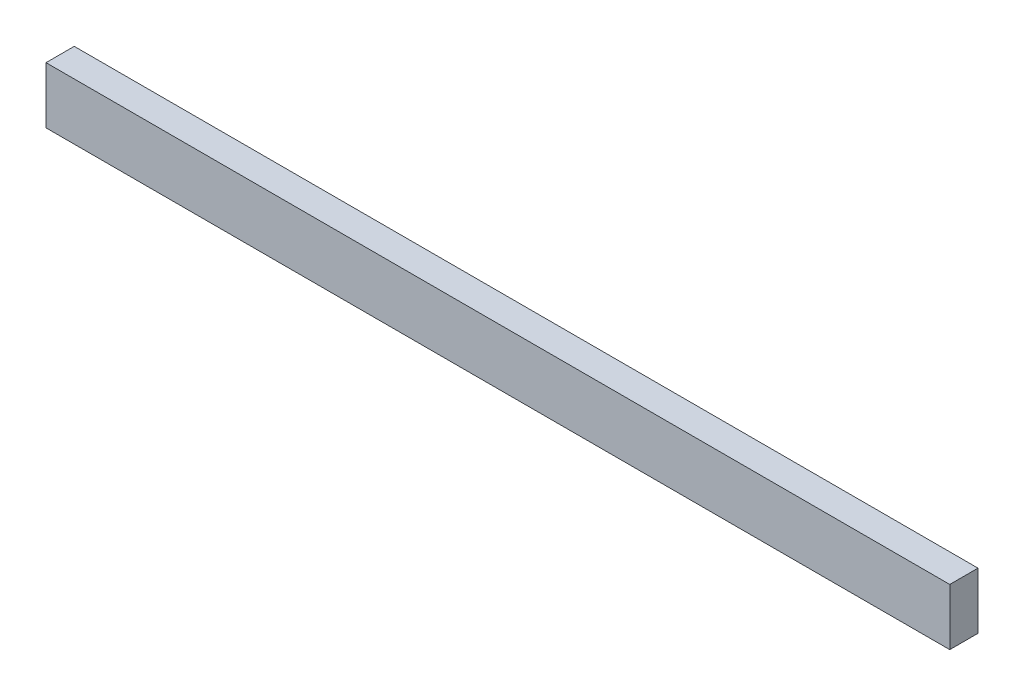
ISO-10303-21;
HEADER;
FILE_DESCRIPTION(('STEP AP214'),'2;1');
FILE_NAME('part.step','',(''),(''),'','','');
FILE_SCHEMA(('AUTOMOTIVE_DESIGN { 1 0 10303 214 1 1 1 1 }'));
ENDSEC;
DATA;
#1=APPLICATION_CONTEXT('core data for automotive mechanical design processes');
#2=APPLICATION_PROTOCOL_DEFINITION('international standard','automotive_design',2000,#1);
#3=PRODUCT_CONTEXT('',#1,'mechanical');
#4=PRODUCT('Part','Part','',(#3));
#5=PRODUCT_RELATED_PRODUCT_CATEGORY('part','',(#4));
#6=PRODUCT_DEFINITION_FORMATION('','',#4);
#7=PRODUCT_DEFINITION_CONTEXT('part definition',#1,'design');
#8=PRODUCT_DEFINITION('design','',#6,#7);
#9=PRODUCT_DEFINITION_SHAPE('','',#8);
#10=(LENGTH_UNIT() NAMED_UNIT(*) SI_UNIT(.MILLI.,.METRE.));
#11=(NAMED_UNIT(*) PLANE_ANGLE_UNIT() SI_UNIT($,.RADIAN.));
#12=(NAMED_UNIT(*) SI_UNIT($,.STERADIAN.) SOLID_ANGLE_UNIT());
#13=UNCERTAINTY_MEASURE_WITH_UNIT(LENGTH_MEASURE(1.E-05),#10,'distance_accuracy_value','');
#14=(GEOMETRIC_REPRESENTATION_CONTEXT(3) GLOBAL_UNCERTAINTY_ASSIGNED_CONTEXT((#13)) GLOBAL_UNIT_ASSIGNED_CONTEXT((#10,
#11,#12)) REPRESENTATION_CONTEXT('',''));
#15=CARTESIAN_POINT('',(0.,0.,0.));
#16=DIRECTION('',(0.,0.,1.));
#17=DIRECTION('',(1.,0.,0.));
#18=AXIS2_PLACEMENT_3D('',#15,#16,#17);
#19=CARTESIAN_POINT('',(0.,76.2,0.));
#20=DIRECTION('',(1.,0.,0.));
#21=DIRECTION('',(0.,0.,-1.));
#22=AXIS2_PLACEMENT_3D('',#19,#20,#21);
#23=PLANE('',#22);
#24=DIRECTION('',(0.,0.,1.));
#25=VECTOR('',#24,1.);
#26=CARTESIAN_POINT('',(0.,0.,0.));
#27=LINE('',#26,#25);
#28=CARTESIAN_POINT('',(0.,0.,-38.1));
#29=VERTEX_POINT('',#28);
#30=CARTESIAN_POINT('',(0.,0.,0.));
#31=VERTEX_POINT('',#30);
#32=EDGE_CURVE('E95',#29,#31,#27,.T.);
#33=ORIENTED_EDGE('',*,*,#32,.T.);
#34=DIRECTION('',(0.,-1.,0.));
#35=VECTOR('',#34,1.);
#36=CARTESIAN_POINT('',(0.,76.2,0.));
#37=LINE('',#36,#35);
#38=CARTESIAN_POINT('',(0.,76.2,0.));
#39=VERTEX_POINT('',#38);
#40=EDGE_CURVE('E11',#39,#31,#37,.T.);
#41=ORIENTED_EDGE('',*,*,#40,.F.);
#42=DIRECTION('',(0.,0.,1.));
#43=VECTOR('',#42,1.);
#44=CARTESIAN_POINT('',(0.,76.2,0.));
#45=LINE('',#44,#43);
#46=CARTESIAN_POINT('',(0.,76.2,-38.1));
#47=VERTEX_POINT('',#46);
#48=EDGE_CURVE('E83',#47,#39,#45,.T.);
#49=ORIENTED_EDGE('',*,*,#48,.F.);
#50=DIRECTION('',(0.,-1.,0.));
#51=VECTOR('',#50,1.);
#52=CARTESIAN_POINT('',(0.,76.2,-38.1));
#53=LINE('',#52,#51);
#54=EDGE_CURVE('E91',#47,#29,#53,.T.);
#55=ORIENTED_EDGE('',*,*,#54,.T.);
#56=EDGE_LOOP('',(#33,#41,#49,#55));
#57=FACE_BOUND('',#56,.T.);
#58=ADVANCED_FACE('F32',(#57),#23,.F.);
#59=CARTESIAN_POINT('',(0.,76.2,0.));
#60=DIRECTION('',(0.,0.,-1.));
#61=DIRECTION('',(-1.,0.,0.));
#62=AXIS2_PLACEMENT_3D('',#59,#60,#61);
#63=PLANE('',#62);
#64=DIRECTION('',(1.,0.,0.));
#65=VECTOR('',#64,1.);
#66=CARTESIAN_POINT('',(0.,0.,0.));
#67=LINE('',#66,#65);
#68=CARTESIAN_POINT('',(1219.2,0.,0.));
#69=VERTEX_POINT('',#68);
#70=EDGE_CURVE('E87',#31,#69,#67,.T.);
#71=ORIENTED_EDGE('',*,*,#70,.T.);
#72=DIRECTION('',(0.,-1.,0.));
#73=VECTOR('',#72,1.);
#74=CARTESIAN_POINT('',(1219.2,76.2,0.));
#75=LINE('',#74,#73);
#76=CARTESIAN_POINT('',(1219.2,76.2,0.));
#77=VERTEX_POINT('',#76);
#78=EDGE_CURVE('E40',#77,#69,#75,.T.);
#79=ORIENTED_EDGE('',*,*,#78,.F.);
#80=DIRECTION('',(1.,0.,0.));
#81=VECTOR('',#80,1.);
#82=CARTESIAN_POINT('',(0.,76.2,0.));
#83=LINE('',#82,#81);
#84=EDGE_CURVE('E78',#39,#77,#83,.T.);
#85=ORIENTED_EDGE('',*,*,#84,.F.);
#86=ORIENTED_EDGE('',*,*,#40,.T.);
#87=EDGE_LOOP('',(#71,#79,#85,#86));
#88=FACE_BOUND('',#87,.T.);
#89=ADVANCED_FACE('F86',(#88),#63,.F.);
#90=CARTESIAN_POINT('',(1219.2,76.2,0.));
#91=DIRECTION('',(-1.,0.,0.));
#92=DIRECTION('',(0.,0.,1.));
#93=AXIS2_PLACEMENT_3D('',#90,#91,#92);
#94=PLANE('',#93);
#95=DIRECTION('',(0.,0.,-1.));
#96=VECTOR('',#95,1.);
#97=CARTESIAN_POINT('',(1219.2,0.,0.));
#98=LINE('',#97,#96);
#99=CARTESIAN_POINT('',(1219.2,0.,-38.1));
#100=VERTEX_POINT('',#99);
#101=EDGE_CURVE('E65',#69,#100,#98,.T.);
#102=ORIENTED_EDGE('',*,*,#101,.T.);
#103=DIRECTION('',(0.,-1.,0.));
#104=VECTOR('',#103,1.);
#105=CARTESIAN_POINT('',(1219.2,76.2,-38.1));
#106=LINE('',#105,#104);
#107=CARTESIAN_POINT('',(1219.2,76.2,-38.1));
#108=VERTEX_POINT('',#107);
#109=EDGE_CURVE('E88',#108,#100,#106,.T.);
#110=ORIENTED_EDGE('',*,*,#109,.F.);
#111=DIRECTION('',(0.,0.,-1.));
#112=VECTOR('',#111,1.);
#113=CARTESIAN_POINT('',(1219.2,76.2,0.));
#114=LINE('',#113,#112);
#115=EDGE_CURVE('E81',#77,#108,#114,.T.);
#116=ORIENTED_EDGE('',*,*,#115,.F.);
#117=ORIENTED_EDGE('',*,*,#78,.T.);
#118=EDGE_LOOP('',(#102,#110,#116,#117));
#119=FACE_BOUND('',#118,.T.);
#120=ADVANCED_FACE('F89',(#119),#94,.F.);
#121=CARTESIAN_POINT('',(0.,76.2,-38.1));
#122=DIRECTION('',(0.,0.,1.));
#123=DIRECTION('',(1.,0.,0.));
#124=AXIS2_PLACEMENT_3D('',#121,#122,#123);
#125=PLANE('',#124);
#126=DIRECTION('',(-1.,0.,0.));
#127=VECTOR('',#126,1.);
#128=CARTESIAN_POINT('',(0.,0.,-38.1));
#129=LINE('',#128,#127);
#130=EDGE_CURVE('E71',#100,#29,#129,.T.);
#131=ORIENTED_EDGE('',*,*,#130,.T.);
#132=ORIENTED_EDGE('',*,*,#54,.F.);
#133=DIRECTION('',(-1.,0.,0.));
#134=VECTOR('',#133,1.);
#135=CARTESIAN_POINT('',(0.,76.2,-38.1));
#136=LINE('',#135,#134);
#137=EDGE_CURVE('E48',#108,#47,#136,.T.);
#138=ORIENTED_EDGE('',*,*,#137,.F.);
#139=ORIENTED_EDGE('',*,*,#109,.T.);
#140=EDGE_LOOP('',(#131,#132,#138,#139));
#141=FACE_BOUND('',#140,.T.);
#142=ADVANCED_FACE('F102',(#141),#125,.F.);
#143=CARTESIAN_POINT('',(0.,76.2,-38.1));
#144=DIRECTION('',(0.,-1.,0.));
#145=DIRECTION('',(0.,0.,-1.));
#146=AXIS2_PLACEMENT_3D('',#143,#144,#145);
#147=PLANE('',#146);
#148=ORIENTED_EDGE('',*,*,#48,.T.);
#149=ORIENTED_EDGE('',*,*,#84,.T.);
#150=ORIENTED_EDGE('',*,*,#115,.T.);
#151=ORIENTED_EDGE('',*,*,#137,.T.);
#152=EDGE_LOOP('',(#148,#149,#150,#151));
#153=FACE_BOUND('',#152,.T.);
#154=ADVANCED_FACE('F79',(#153),#147,.F.);
#155=CARTESIAN_POINT('',(0.,0.,-38.1));
#156=DIRECTION('',(0.,-1.,0.));
#157=DIRECTION('',(0.,0.,-1.));
#158=AXIS2_PLACEMENT_3D('',#155,#156,#157);
#159=PLANE('',#158);
#160=ORIENTED_EDGE('',*,*,#32,.F.);
#161=ORIENTED_EDGE('',*,*,#130,.F.);
#162=ORIENTED_EDGE('',*,*,#101,.F.);
#163=ORIENTED_EDGE('',*,*,#70,.F.);
#164=EDGE_LOOP('',(#160,#161,#162,#163));
#165=FACE_BOUND('',#164,.T.);
#166=ADVANCED_FACE('F105',(#165),#159,.T.);
#167=CLOSED_SHELL('',(#58,#89,#120,#142,#154,#166));
#168=MANIFOLD_SOLID_BREP('B2',#167);
#169=ADVANCED_BREP_SHAPE_REPRESENTATION('',(#18,#168),#14);
#170=SHAPE_DEFINITION_REPRESENTATION(#9,#169);
ENDSEC;
END-ISO-10303-21;
